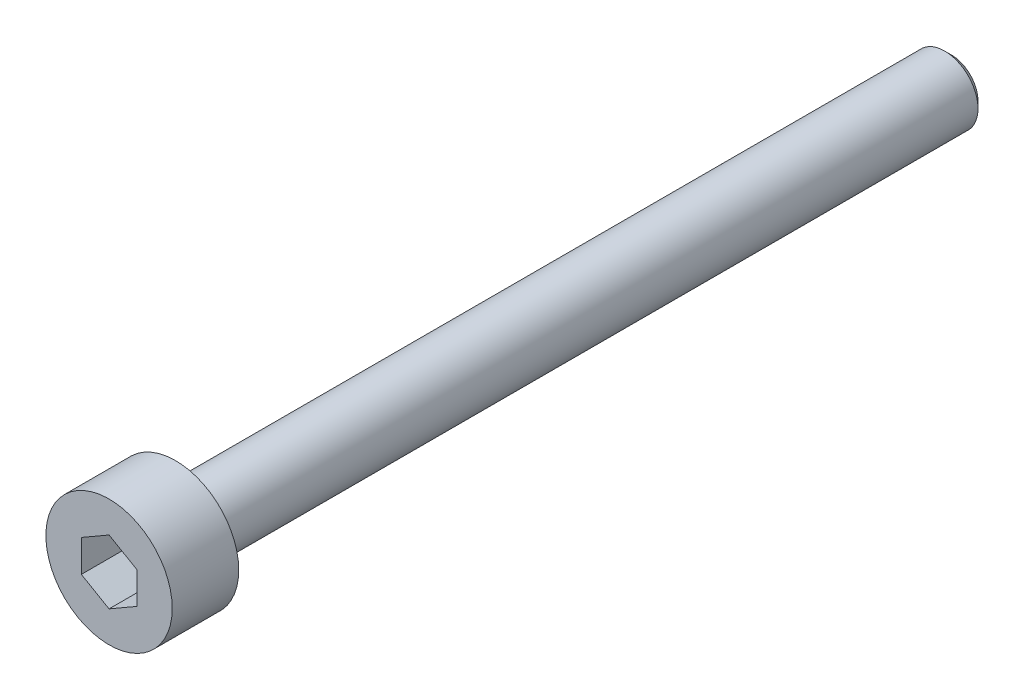
ISO-10303-21;
HEADER;
FILE_DESCRIPTION(('STEP AP214'),'2;1');
FILE_NAME('part.step','',(''),(''),'','','');
FILE_SCHEMA(('AUTOMOTIVE_DESIGN { 1 0 10303 214 1 1 1 1 }'));
ENDSEC;
DATA;
#1=APPLICATION_CONTEXT('core data for automotive mechanical design processes');
#2=APPLICATION_PROTOCOL_DEFINITION('international standard','automotive_design',2000,#1);
#3=PRODUCT_CONTEXT('',#1,'mechanical');
#4=PRODUCT('Part','Part','',(#3));
#5=PRODUCT_RELATED_PRODUCT_CATEGORY('part','',(#4));
#6=PRODUCT_DEFINITION_FORMATION('','',#4);
#7=PRODUCT_DEFINITION_CONTEXT('part definition',#1,'design');
#8=PRODUCT_DEFINITION('design','',#6,#7);
#9=PRODUCT_DEFINITION_SHAPE('','',#8);
#10=(LENGTH_UNIT() NAMED_UNIT(*) SI_UNIT(.MILLI.,.METRE.));
#11=(NAMED_UNIT(*) PLANE_ANGLE_UNIT() SI_UNIT($,.RADIAN.));
#12=(NAMED_UNIT(*) SI_UNIT($,.STERADIAN.) SOLID_ANGLE_UNIT());
#13=UNCERTAINTY_MEASURE_WITH_UNIT(LENGTH_MEASURE(1.E-05),#10,'distance_accuracy_value','');
#14=(GEOMETRIC_REPRESENTATION_CONTEXT(3) GLOBAL_UNCERTAINTY_ASSIGNED_CONTEXT((#13)) GLOBAL_UNIT_ASSIGNED_CONTEXT((#10,
#11,#12)) REPRESENTATION_CONTEXT('',''));
#15=CARTESIAN_POINT('',(0.,0.,0.));
#16=DIRECTION('',(0.,0.,1.));
#17=DIRECTION('',(1.,0.,0.));
#18=AXIS2_PLACEMENT_3D('',#15,#16,#17);
#19=CARTESIAN_POINT('',(0.,0.,0.));
#20=DIRECTION('',(0.,0.,1.));
#21=DIRECTION('',(1.,0.,0.));
#22=AXIS2_PLACEMENT_3D('',#19,#20,#21);
#23=PLANE('',#22);
#24=CARTESIAN_POINT('',(0.,0.,0.));
#25=DIRECTION('',(0.,0.,1.));
#26=DIRECTION('',(1.,0.,0.));
#27=AXIS2_PLACEMENT_3D('',#24,#25,#26);
#28=CIRCLE('',#27,2.85);
#29=CARTESIAN_POINT('',(2.85,0.,0.));
#30=VERTEX_POINT('',#29);
#31=EDGE_CURVE('E140',#30,#30,#28,.T.);
#32=ORIENTED_EDGE('',*,*,#31,.F.);
#33=EDGE_LOOP('',(#32));
#34=FACE_BOUND('',#33,.T.);
#35=CARTESIAN_POINT('',(0.,0.,0.));
#36=DIRECTION('',(0.,0.,1.));
#37=DIRECTION('',(1.,0.,0.));
#38=AXIS2_PLACEMENT_3D('',#35,#36,#37);
#39=CIRCLE('',#38,1.5);
#40=CARTESIAN_POINT('',(1.5,0.,0.));
#41=VERTEX_POINT('',#40);
#42=EDGE_CURVE('E149',#41,#41,#39,.F.);
#43=ORIENTED_EDGE('',*,*,#42,.F.);
#44=EDGE_LOOP('',(#43));
#45=FACE_BOUND('',#44,.T.);
#46=ADVANCED_FACE('F38',(#34,#45),#23,.F.);
#47=CARTESIAN_POINT('',(0.,0.,3.));
#48=DIRECTION('',(0.,0.,-1.));
#49=DIRECTION('',(-1.,0.,0.));
#50=AXIS2_PLACEMENT_3D('',#47,#48,#49);
#51=CYLINDRICAL_SURFACE('',#50,2.85);
#52=CARTESIAN_POINT('',(0.,0.,3.));
#53=DIRECTION('',(0.,0.,1.));
#54=DIRECTION('',(1.,0.,0.));
#55=AXIS2_PLACEMENT_3D('',#52,#53,#54);
#56=CIRCLE('',#55,2.85);
#57=CARTESIAN_POINT('',(2.85,0.,3.));
#58=VERTEX_POINT('',#57);
#59=EDGE_CURVE('E146',#58,#58,#56,.T.);
#60=ORIENTED_EDGE('',*,*,#59,.F.);
#61=EDGE_LOOP('',(#60));
#62=FACE_BOUND('',#61,.T.);
#63=ORIENTED_EDGE('',*,*,#31,.T.);
#64=EDGE_LOOP('',(#63));
#65=FACE_BOUND('',#64,.T.);
#66=ADVANCED_FACE('F171',(#62,#65),#51,.T.);
#67=CARTESIAN_POINT('',(0.,0.,3.));
#68=DIRECTION('',(0.,0.,1.));
#69=DIRECTION('',(1.,0.,0.));
#70=AXIS2_PLACEMENT_3D('',#67,#68,#69);
#71=PLANE('',#70);
#72=DIRECTION('',(-0.866025403784439,0.5,0.));
#73=VECTOR('',#72,1.);
#74=CARTESIAN_POINT('',(1.25,0.721687836487032,3.));
#75=LINE('',#74,#73);
#76=CARTESIAN_POINT('',(1.25,0.721687836487032,3.));
#77=VERTEX_POINT('',#76);
#78=CARTESIAN_POINT('',(0.,1.44337567297406,3.));
#79=VERTEX_POINT('',#78);
#80=EDGE_CURVE('E53',#77,#79,#75,.T.);
#81=ORIENTED_EDGE('',*,*,#80,.F.);
#82=DIRECTION('',(0.,1.,0.));
#83=VECTOR('',#82,1.);
#84=CARTESIAN_POINT('',(1.25,-0.721687836487032,3.));
#85=LINE('',#84,#83);
#86=CARTESIAN_POINT('',(1.25,-0.721687836487032,3.));
#87=VERTEX_POINT('',#86);
#88=EDGE_CURVE('E136',#87,#77,#85,.T.);
#89=ORIENTED_EDGE('',*,*,#88,.F.);
#90=DIRECTION('',(0.866025403784439,0.5,0.));
#91=VECTOR('',#90,1.);
#92=CARTESIAN_POINT('',(0.,-1.44337567297406,3.));
#93=LINE('',#92,#91);
#94=CARTESIAN_POINT('',(0.,-1.44337567297406,3.));
#95=VERTEX_POINT('',#94);
#96=EDGE_CURVE('E134',#95,#87,#93,.T.);
#97=ORIENTED_EDGE('',*,*,#96,.F.);
#98=DIRECTION('',(0.866025403784439,-0.5,0.));
#99=VECTOR('',#98,1.);
#100=CARTESIAN_POINT('',(-1.25,-0.721687836487033,3.));
#101=LINE('',#100,#99);
#102=CARTESIAN_POINT('',(-1.25,-0.721687836487033,3.));
#103=VERTEX_POINT('',#102);
#104=EDGE_CURVE('E101',#103,#95,#101,.T.);
#105=ORIENTED_EDGE('',*,*,#104,.F.);
#106=DIRECTION('',(0.,-1.,0.));
#107=VECTOR('',#106,1.);
#108=CARTESIAN_POINT('',(-1.25,0.721687836487032,3.));
#109=LINE('',#108,#107);
#110=CARTESIAN_POINT('',(-1.25,0.721687836487032,3.));
#111=VERTEX_POINT('',#110);
#112=EDGE_CURVE('E130',#111,#103,#109,.T.);
#113=ORIENTED_EDGE('',*,*,#112,.F.);
#114=DIRECTION('',(-0.866025403784439,-0.5,0.));
#115=VECTOR('',#114,1.);
#116=CARTESIAN_POINT('',(0.,1.44337567297406,3.));
#117=LINE('',#116,#115);
#118=EDGE_CURVE('E127',#79,#111,#117,.T.);
#119=ORIENTED_EDGE('',*,*,#118,.F.);
#120=EDGE_LOOP('',(#81,#89,#97,#105,#113,#119));
#121=FACE_BOUND('',#120,.T.);
#122=ORIENTED_EDGE('',*,*,#59,.T.);
#123=EDGE_LOOP('',(#122));
#124=FACE_BOUND('',#123,.T.);
#125=ADVANCED_FACE('F177',(#121,#124),#71,.T.);
#126=CARTESIAN_POINT('',(0.,0.,-35.));
#127=DIRECTION('',(0.,0.,1.));
#128=DIRECTION('',(1.,0.,0.));
#129=AXIS2_PLACEMENT_3D('',#126,#127,#128);
#130=CYLINDRICAL_SURFACE('',#129,1.5);
#131=CARTESIAN_POINT('',(0.,0.,-34.7));
#132=DIRECTION('',(0.,0.,-1.));
#133=DIRECTION('',(-1.,0.,0.));
#134=AXIS2_PLACEMENT_3D('',#131,#132,#133);
#135=CIRCLE('',#134,1.5);
#136=CARTESIAN_POINT('',(-1.5,0.,-34.7));
#137=VERTEX_POINT('',#136);
#138=EDGE_CURVE('E11',#137,#137,#135,.F.);
#139=ORIENTED_EDGE('',*,*,#138,.T.);
#140=EDGE_LOOP('',(#139));
#141=FACE_BOUND('',#140,.T.);
#142=ORIENTED_EDGE('',*,*,#42,.T.);
#143=EDGE_LOOP('',(#142));
#144=FACE_BOUND('',#143,.T.);
#145=ADVANCED_FACE('F167',(#141,#144),#130,.T.);
#146=CARTESIAN_POINT('',(0.,0.,-35.));
#147=DIRECTION('',(0.,0.,-1.));
#148=DIRECTION('',(-1.,0.,0.));
#149=AXIS2_PLACEMENT_3D('',#146,#147,#148);
#150=PLANE('',#149);
#151=CARTESIAN_POINT('',(0.,0.,-35.));
#152=DIRECTION('',(0.,0.,-1.));
#153=DIRECTION('',(-1.,0.,0.));
#154=AXIS2_PLACEMENT_3D('',#151,#152,#153);
#155=CIRCLE('',#154,1.2);
#156=CARTESIAN_POINT('',(-1.2,0.,-35.));
#157=VERTEX_POINT('',#156);
#158=EDGE_CURVE('E46',#157,#157,#155,.T.);
#159=ORIENTED_EDGE('',*,*,#158,.T.);
#160=EDGE_LOOP('',(#159));
#161=FACE_BOUND('',#160,.T.);
#162=ADVANCED_FACE('F156',(#161),#150,.T.);
#163=CARTESIAN_POINT('',(0.,0.,-35.));
#164=DIRECTION('',(0.,0.,1.));
#165=DIRECTION('',(1.,0.,0.));
#166=AXIS2_PLACEMENT_3D('',#163,#164,#165);
#167=CONICAL_SURFACE('',#166,1.2,0.785398163397441);
#168=ORIENTED_EDGE('',*,*,#138,.F.);
#169=EDGE_LOOP('',(#168));
#170=FACE_BOUND('',#169,.T.);
#171=ORIENTED_EDGE('',*,*,#158,.F.);
#172=EDGE_LOOP('',(#171));
#173=FACE_BOUND('',#172,.T.);
#174=ADVANCED_FACE('F40',(#170,#173),#167,.T.);
#175=CARTESIAN_POINT('',(1.25,0.721687836487032,1.));
#176=DIRECTION('',(0.5,0.866025403784439,0.));
#177=DIRECTION('',(-0.866025403784439,0.5,0.));
#178=AXIS2_PLACEMENT_3D('',#175,#176,#177);
#179=PLANE('',#178);
#180=ORIENTED_EDGE('',*,*,#80,.T.);
#181=DIRECTION('',(0.,0.,1.));
#182=VECTOR('',#181,1.);
#183=CARTESIAN_POINT('',(0.,1.44337567297406,1.));
#184=LINE('',#183,#182);
#185=CARTESIAN_POINT('',(0.,1.44337567297406,1.));
#186=VERTEX_POINT('',#185);
#187=EDGE_CURVE('E83',#186,#79,#184,.T.);
#188=ORIENTED_EDGE('',*,*,#187,.F.);
#189=DIRECTION('',(-0.866025403784439,0.5,0.));
#190=VECTOR('',#189,1.);
#191=CARTESIAN_POINT('',(1.25,0.721687836487032,1.));
#192=LINE('',#191,#190);
#193=CARTESIAN_POINT('',(1.25,0.721687836487032,1.));
#194=VERTEX_POINT('',#193);
#195=EDGE_CURVE('E138',#194,#186,#192,.T.);
#196=ORIENTED_EDGE('',*,*,#195,.F.);
#197=DIRECTION('',(0.,0.,1.));
#198=VECTOR('',#197,1.);
#199=CARTESIAN_POINT('',(1.25,0.721687836487032,1.));
#200=LINE('',#199,#198);
#201=EDGE_CURVE('E61',#194,#77,#200,.T.);
#202=ORIENTED_EDGE('',*,*,#201,.T.);
#203=EDGE_LOOP('',(#180,#188,#196,#202));
#204=FACE_BOUND('',#203,.T.);
#205=ADVANCED_FACE('F159',(#204),#179,.F.);
#206=CARTESIAN_POINT('',(1.25,-0.721687836487032,1.));
#207=DIRECTION('',(1.,0.,0.));
#208=DIRECTION('',(0.,1.,0.));
#209=AXIS2_PLACEMENT_3D('',#206,#207,#208);
#210=PLANE('',#209);
#211=ORIENTED_EDGE('',*,*,#88,.T.);
#212=ORIENTED_EDGE('',*,*,#201,.F.);
#213=DIRECTION('',(0.,1.,0.));
#214=VECTOR('',#213,1.);
#215=CARTESIAN_POINT('',(1.25,-0.721687836487032,1.));
#216=LINE('',#215,#214);
#217=CARTESIAN_POINT('',(1.25,-0.721687836487032,1.));
#218=VERTEX_POINT('',#217);
#219=EDGE_CURVE('E113',#218,#194,#216,.T.);
#220=ORIENTED_EDGE('',*,*,#219,.F.);
#221=DIRECTION('',(0.,0.,1.));
#222=VECTOR('',#221,1.);
#223=CARTESIAN_POINT('',(1.25,-0.721687836487032,1.));
#224=LINE('',#223,#222);
#225=EDGE_CURVE('E105',#218,#87,#224,.T.);
#226=ORIENTED_EDGE('',*,*,#225,.T.);
#227=EDGE_LOOP('',(#211,#212,#220,#226));
#228=FACE_BOUND('',#227,.T.);
#229=ADVANCED_FACE('F165',(#228),#210,.F.);
#230=CARTESIAN_POINT('',(0.,-1.44337567297406,1.));
#231=DIRECTION('',(0.5,-0.866025403784439,0.));
#232=DIRECTION('',(0.866025403784439,0.5,0.));
#233=AXIS2_PLACEMENT_3D('',#230,#231,#232);
#234=PLANE('',#233);
#235=ORIENTED_EDGE('',*,*,#96,.T.);
#236=ORIENTED_EDGE('',*,*,#225,.F.);
#237=DIRECTION('',(0.866025403784439,0.5,0.));
#238=VECTOR('',#237,1.);
#239=CARTESIAN_POINT('',(0.,-1.44337567297406,1.));
#240=LINE('',#239,#238);
#241=CARTESIAN_POINT('',(0.,-1.44337567297406,1.));
#242=VERTEX_POINT('',#241);
#243=EDGE_CURVE('E109',#242,#218,#240,.T.);
#244=ORIENTED_EDGE('',*,*,#243,.F.);
#245=DIRECTION('',(0.,0.,1.));
#246=VECTOR('',#245,1.);
#247=CARTESIAN_POINT('',(0.,-1.44337567297406,1.));
#248=LINE('',#247,#246);
#249=EDGE_CURVE('E94',#242,#95,#248,.T.);
#250=ORIENTED_EDGE('',*,*,#249,.T.);
#251=EDGE_LOOP('',(#235,#236,#244,#250));
#252=FACE_BOUND('',#251,.T.);
#253=ADVANCED_FACE('F110',(#252),#234,.F.);
#254=CARTESIAN_POINT('',(-1.25,-0.721687836487033,1.));
#255=DIRECTION('',(-0.5,-0.866025403784439,0.));
#256=DIRECTION('',(0.866025403784439,-0.5,0.));
#257=AXIS2_PLACEMENT_3D('',#254,#255,#256);
#258=PLANE('',#257);
#259=ORIENTED_EDGE('',*,*,#104,.T.);
#260=ORIENTED_EDGE('',*,*,#249,.F.);
#261=DIRECTION('',(0.866025403784439,-0.5,0.));
#262=VECTOR('',#261,1.);
#263=CARTESIAN_POINT('',(-1.25,-0.721687836487033,1.));
#264=LINE('',#263,#262);
#265=CARTESIAN_POINT('',(-1.25,-0.721687836487033,1.));
#266=VERTEX_POINT('',#265);
#267=EDGE_CURVE('E98',#266,#242,#264,.T.);
#268=ORIENTED_EDGE('',*,*,#267,.F.);
#269=DIRECTION('',(0.,0.,1.));
#270=VECTOR('',#269,1.);
#271=CARTESIAN_POINT('',(-1.25,-0.721687836487033,1.));
#272=LINE('',#271,#270);
#273=EDGE_CURVE('E106',#266,#103,#272,.T.);
#274=ORIENTED_EDGE('',*,*,#273,.T.);
#275=EDGE_LOOP('',(#259,#260,#268,#274));
#276=FACE_BOUND('',#275,.T.);
#277=ADVANCED_FACE('F96',(#276),#258,.F.);
#278=CARTESIAN_POINT('',(-1.25,0.721687836487032,1.));
#279=DIRECTION('',(-1.,0.,0.));
#280=DIRECTION('',(0.,0.,1.));
#281=AXIS2_PLACEMENT_3D('',#278,#279,#280);
#282=PLANE('',#281);
#283=ORIENTED_EDGE('',*,*,#112,.T.);
#284=ORIENTED_EDGE('',*,*,#273,.F.);
#285=DIRECTION('',(0.,-1.,0.));
#286=VECTOR('',#285,1.);
#287=CARTESIAN_POINT('',(-1.25,0.721687836487032,1.));
#288=LINE('',#287,#286);
#289=CARTESIAN_POINT('',(-1.25,0.721687836487032,1.));
#290=VERTEX_POINT('',#289);
#291=EDGE_CURVE('E119',#290,#266,#288,.T.);
#292=ORIENTED_EDGE('',*,*,#291,.F.);
#293=DIRECTION('',(0.,0.,1.));
#294=VECTOR('',#293,1.);
#295=CARTESIAN_POINT('',(-1.25,0.721687836487032,1.));
#296=LINE('',#295,#294);
#297=EDGE_CURVE('E143',#290,#111,#296,.T.);
#298=ORIENTED_EDGE('',*,*,#297,.T.);
#299=EDGE_LOOP('',(#283,#284,#292,#298));
#300=FACE_BOUND('',#299,.T.);
#301=ADVANCED_FACE('F191',(#300),#282,.F.);
#302=CARTESIAN_POINT('',(0.,1.44337567297406,1.));
#303=DIRECTION('',(-0.5,0.866025403784439,0.));
#304=DIRECTION('',(-0.866025403784439,-0.5,0.));
#305=AXIS2_PLACEMENT_3D('',#302,#303,#304);
#306=PLANE('',#305);
#307=ORIENTED_EDGE('',*,*,#118,.T.);
#308=ORIENTED_EDGE('',*,*,#297,.F.);
#309=DIRECTION('',(-0.866025403784439,-0.5,0.));
#310=VECTOR('',#309,1.);
#311=CARTESIAN_POINT('',(0.,1.44337567297406,1.));
#312=LINE('',#311,#310);
#313=EDGE_CURVE('E121',#186,#290,#312,.T.);
#314=ORIENTED_EDGE('',*,*,#313,.F.);
#315=ORIENTED_EDGE('',*,*,#187,.T.);
#316=EDGE_LOOP('',(#307,#308,#314,#315));
#317=FACE_BOUND('',#316,.T.);
#318=ADVANCED_FACE('F188',(#317),#306,.F.);
#319=CARTESIAN_POINT('',(0.,0.,1.));
#320=DIRECTION('',(0.,0.,1.));
#321=DIRECTION('',(1.,0.,0.));
#322=AXIS2_PLACEMENT_3D('',#319,#320,#321);
#323=PLANE('',#322);
#324=ORIENTED_EDGE('',*,*,#195,.T.);
#325=ORIENTED_EDGE('',*,*,#313,.T.);
#326=ORIENTED_EDGE('',*,*,#291,.T.);
#327=ORIENTED_EDGE('',*,*,#267,.T.);
#328=ORIENTED_EDGE('',*,*,#243,.T.);
#329=ORIENTED_EDGE('',*,*,#219,.T.);
#330=EDGE_LOOP('',(#324,#325,#326,#327,#328,#329));
#331=FACE_BOUND('',#330,.T.);
#332=ADVANCED_FACE('F116',(#331),#323,.T.);
#333=CLOSED_SHELL('',(#46,#66,#125,#145,#162,#174,#205,#229,#253,#277,#301,#318,#332));
#334=MANIFOLD_SOLID_BREP('B2',#333);
#335=ADVANCED_BREP_SHAPE_REPRESENTATION('',(#18,#334),#14);
#336=SHAPE_DEFINITION_REPRESENTATION(#9,#335);
ENDSEC;
END-ISO-10303-21;
